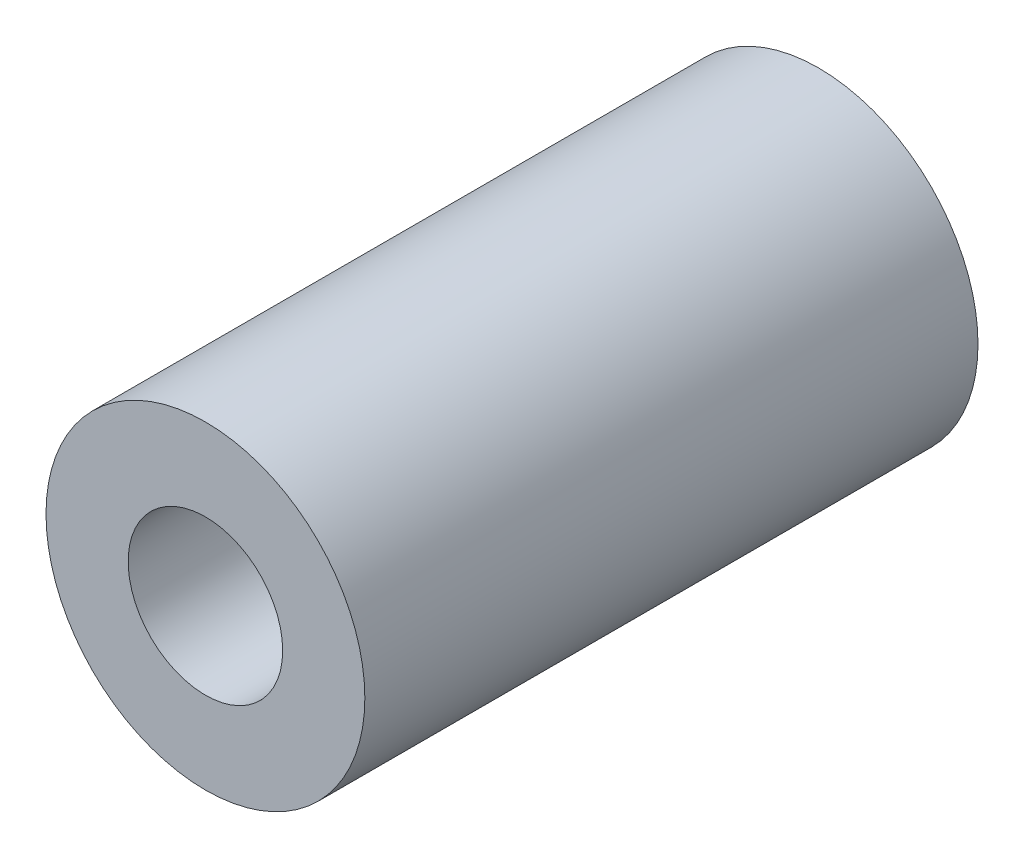
ISO-10303-21;
HEADER;
FILE_DESCRIPTION(('STEP AP214'),'2;1');
FILE_NAME('part.step','',(''),(''),'','','');
FILE_SCHEMA(('AUTOMOTIVE_DESIGN { 1 0 10303 214 1 1 1 1 }'));
ENDSEC;
DATA;
#1=APPLICATION_CONTEXT('core data for automotive mechanical design processes');
#2=APPLICATION_PROTOCOL_DEFINITION('international standard','automotive_design',2000,#1);
#3=PRODUCT_CONTEXT('',#1,'mechanical');
#4=PRODUCT('Part','Part','',(#3));
#5=PRODUCT_RELATED_PRODUCT_CATEGORY('part','',(#4));
#6=PRODUCT_DEFINITION_FORMATION('','',#4);
#7=PRODUCT_DEFINITION_CONTEXT('part definition',#1,'design');
#8=PRODUCT_DEFINITION('design','',#6,#7);
#9=PRODUCT_DEFINITION_SHAPE('','',#8);
#10=(LENGTH_UNIT() NAMED_UNIT(*) SI_UNIT(.MILLI.,.METRE.));
#11=(NAMED_UNIT(*) PLANE_ANGLE_UNIT() SI_UNIT($,.RADIAN.));
#12=(NAMED_UNIT(*) SI_UNIT($,.STERADIAN.) SOLID_ANGLE_UNIT());
#13=UNCERTAINTY_MEASURE_WITH_UNIT(LENGTH_MEASURE(1.E-05),#10,'distance_accuracy_value','');
#14=(GEOMETRIC_REPRESENTATION_CONTEXT(3) GLOBAL_UNCERTAINTY_ASSIGNED_CONTEXT((#13)) GLOBAL_UNIT_ASSIGNED_CONTEXT((#10,
#11,#12)) REPRESENTATION_CONTEXT('',''));
#15=CARTESIAN_POINT('',(0.,0.,0.));
#16=DIRECTION('',(0.,0.,1.));
#17=DIRECTION('',(1.,0.,0.));
#18=AXIS2_PLACEMENT_3D('',#15,#16,#17);
#19=CARTESIAN_POINT('',(0.,0.,12.5));
#20=DIRECTION('',(0.,0.,1.));
#21=DIRECTION('',(1.,0.,0.));
#22=AXIS2_PLACEMENT_3D('',#19,#20,#21);
#23=PLANE('',#22);
#24=CARTESIAN_POINT('',(0.,0.,12.5));
#25=DIRECTION('',(0.,0.,1.));
#26=DIRECTION('',(1.,0.,0.));
#27=AXIS2_PLACEMENT_3D('',#24,#25,#26);
#28=CIRCLE('',#27,6.5);
#29=CARTESIAN_POINT('',(6.5,0.,12.5));
#30=VERTEX_POINT('',#29);
#31=EDGE_CURVE('E10',#30,#30,#28,.T.);
#32=ORIENTED_EDGE('',*,*,#31,.T.);
#33=EDGE_LOOP('',(#32));
#34=FACE_BOUND('',#33,.T.);
#35=CARTESIAN_POINT('',(0.,0.,12.5));
#36=DIRECTION('',(0.,0.,1.));
#37=DIRECTION('',(1.,0.,0.));
#38=AXIS2_PLACEMENT_3D('',#35,#36,#37);
#39=CIRCLE('',#38,3.15);
#40=CARTESIAN_POINT('',(3.15,0.,12.5));
#41=VERTEX_POINT('',#40);
#42=EDGE_CURVE('E38',#41,#41,#39,.T.);
#43=ORIENTED_EDGE('',*,*,#42,.F.);
#44=EDGE_LOOP('',(#43));
#45=FACE_BOUND('',#44,.T.);
#46=ADVANCED_FACE('F31',(#34,#45),#23,.T.);
#47=CARTESIAN_POINT('',(0.,0.,12.5));
#48=DIRECTION('',(0.,0.,-1.));
#49=DIRECTION('',(-1.,0.,0.));
#50=AXIS2_PLACEMENT_3D('',#47,#48,#49);
#51=CYLINDRICAL_SURFACE('',#50,6.5);
#52=ORIENTED_EDGE('',*,*,#31,.F.);
#53=EDGE_LOOP('',(#52));
#54=FACE_BOUND('',#53,.T.);
#55=CARTESIAN_POINT('',(0.,0.,-12.5));
#56=DIRECTION('',(0.,0.,1.));
#57=DIRECTION('',(1.,0.,0.));
#58=AXIS2_PLACEMENT_3D('',#55,#56,#57);
#59=CIRCLE('',#58,6.5);
#60=CARTESIAN_POINT('',(6.5,0.,-12.5));
#61=VERTEX_POINT('',#60);
#62=EDGE_CURVE('E42',#61,#61,#59,.T.);
#63=ORIENTED_EDGE('',*,*,#62,.T.);
#64=EDGE_LOOP('',(#63));
#65=FACE_BOUND('',#64,.T.);
#66=ADVANCED_FACE('F33',(#54,#65),#51,.T.);
#67=CARTESIAN_POINT('',(0.,0.,12.5));
#68=DIRECTION('',(0.,0.,-1.));
#69=DIRECTION('',(-1.,0.,0.));
#70=AXIS2_PLACEMENT_3D('',#67,#68,#69);
#71=CYLINDRICAL_SURFACE('',#70,3.15);
#72=ORIENTED_EDGE('',*,*,#42,.T.);
#73=EDGE_LOOP('',(#72));
#74=FACE_BOUND('',#73,.T.);
#75=CARTESIAN_POINT('',(0.,0.,-12.5));
#76=DIRECTION('',(0.,0.,1.));
#77=DIRECTION('',(1.,0.,0.));
#78=AXIS2_PLACEMENT_3D('',#75,#76,#77);
#79=CIRCLE('',#78,3.15);
#80=CARTESIAN_POINT('',(3.15,0.,-12.5));
#81=VERTEX_POINT('',#80);
#82=EDGE_CURVE('E46',#81,#81,#79,.T.);
#83=ORIENTED_EDGE('',*,*,#82,.F.);
#84=EDGE_LOOP('',(#83));
#85=FACE_BOUND('',#84,.T.);
#86=ADVANCED_FACE('F55',(#74,#85),#71,.F.);
#87=CARTESIAN_POINT('',(0.,0.,-12.5));
#88=DIRECTION('',(0.,0.,1.));
#89=DIRECTION('',(1.,0.,0.));
#90=AXIS2_PLACEMENT_3D('',#87,#88,#89);
#91=PLANE('',#90);
#92=ORIENTED_EDGE('',*,*,#82,.T.);
#93=EDGE_LOOP('',(#92));
#94=FACE_BOUND('',#93,.T.);
#95=ORIENTED_EDGE('',*,*,#62,.F.);
#96=EDGE_LOOP('',(#95));
#97=FACE_BOUND('',#96,.T.);
#98=ADVANCED_FACE('F52',(#94,#97),#91,.F.);
#99=CLOSED_SHELL('',(#46,#66,#86,#98));
#100=MANIFOLD_SOLID_BREP('B2',#99);
#101=ADVANCED_BREP_SHAPE_REPRESENTATION('',(#18,#100),#14);
#102=SHAPE_DEFINITION_REPRESENTATION(#9,#101);
ENDSEC;
END-ISO-10303-21;
